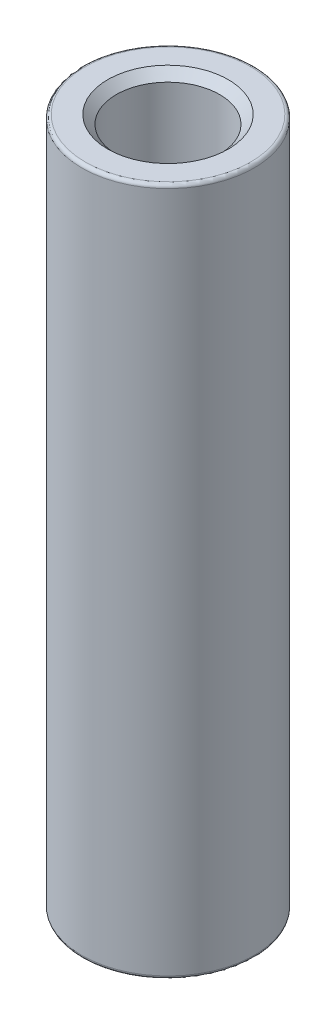
ISO-10303-21;
HEADER;
FILE_DESCRIPTION(('STEP AP214'),'2;1');
FILE_NAME('part.step','',(''),(''),'','','');
FILE_SCHEMA(('AUTOMOTIVE_DESIGN { 1 0 10303 214 1 1 1 1 }'));
ENDSEC;
DATA;
#1=APPLICATION_CONTEXT('core data for automotive mechanical design processes');
#2=APPLICATION_PROTOCOL_DEFINITION('international standard','automotive_design',2000,#1);
#3=PRODUCT_CONTEXT('',#1,'mechanical');
#4=PRODUCT('Part','Part','',(#3));
#5=PRODUCT_RELATED_PRODUCT_CATEGORY('part','',(#4));
#6=PRODUCT_DEFINITION_FORMATION('','',#4);
#7=PRODUCT_DEFINITION_CONTEXT('part definition',#1,'design');
#8=PRODUCT_DEFINITION('design','',#6,#7);
#9=PRODUCT_DEFINITION_SHAPE('','',#8);
#10=(LENGTH_UNIT() NAMED_UNIT(*) SI_UNIT(.MILLI.,.METRE.));
#11=(NAMED_UNIT(*) PLANE_ANGLE_UNIT() SI_UNIT($,.RADIAN.));
#12=(NAMED_UNIT(*) SI_UNIT($,.STERADIAN.) SOLID_ANGLE_UNIT());
#13=UNCERTAINTY_MEASURE_WITH_UNIT(LENGTH_MEASURE(1.E-05),#10,'distance_accuracy_value','');
#14=(GEOMETRIC_REPRESENTATION_CONTEXT(3) GLOBAL_UNCERTAINTY_ASSIGNED_CONTEXT((#13)) GLOBAL_UNIT_ASSIGNED_CONTEXT((#10,
#11,#12)) REPRESENTATION_CONTEXT('',''));
#15=CARTESIAN_POINT('',(0.,0.,0.));
#16=DIRECTION('',(0.,0.,1.));
#17=DIRECTION('',(1.,0.,0.));
#18=AXIS2_PLACEMENT_3D('',#15,#16,#17);
#19=CARTESIAN_POINT('',(0.,10.,0.));
#20=DIRECTION('',(0.,1.,0.));
#21=DIRECTION('',(0.,0.,1.));
#22=AXIS2_PLACEMENT_3D('',#19,#20,#21);
#23=PLANE('',#22);
#24=CARTESIAN_POINT('',(0.,10.,0.));
#25=DIRECTION('',(0.,1.,0.));
#26=DIRECTION('',(0.,0.,1.));
#27=AXIS2_PLACEMENT_3D('',#24,#25,#26);
#28=CIRCLE('',#27,2.4);
#29=CARTESIAN_POINT('',(0.,10.,2.4));
#30=VERTEX_POINT('',#29);
#31=EDGE_CURVE('E10',#30,#30,#28,.T.);
#32=ORIENTED_EDGE('',*,*,#31,.T.);
#33=EDGE_LOOP('',(#32));
#34=FACE_BOUND('',#33,.T.);
#35=CARTESIAN_POINT('',(0.,10.,0.));
#36=DIRECTION('',(0.,1.,0.));
#37=DIRECTION('',(0.,0.,1.));
#38=AXIS2_PLACEMENT_3D('',#35,#36,#37);
#39=CIRCLE('',#38,1.75);
#40=CARTESIAN_POINT('',(0.,10.,1.75));
#41=VERTEX_POINT('',#40);
#42=EDGE_CURVE('E53',#41,#41,#39,.F.);
#43=ORIENTED_EDGE('',*,*,#42,.T.);
#44=EDGE_LOOP('',(#43));
#45=FACE_BOUND('',#44,.T.);
#46=ADVANCED_FACE('F33',(#34,#45),#23,.T.);
#47=CARTESIAN_POINT('',(0.,-10.,0.));
#48=DIRECTION('',(0.,1.,0.));
#49=DIRECTION('',(0.,0.,1.));
#50=AXIS2_PLACEMENT_3D('',#47,#48,#49);
#51=PLANE('',#50);
#52=CARTESIAN_POINT('',(0.,-10.,0.));
#53=DIRECTION('',(0.,1.,0.));
#54=DIRECTION('',(0.,0.,1.));
#55=AXIS2_PLACEMENT_3D('',#52,#53,#54);
#56=CIRCLE('',#55,2.4);
#57=CARTESIAN_POINT('',(0.,-10.,2.4));
#58=VERTEX_POINT('',#57);
#59=EDGE_CURVE('E40',#58,#58,#56,.F.);
#60=ORIENTED_EDGE('',*,*,#59,.T.);
#61=EDGE_LOOP('',(#60));
#62=FACE_BOUND('',#61,.T.);
#63=CARTESIAN_POINT('',(0.,-10.,0.));
#64=DIRECTION('',(0.,1.,0.));
#65=DIRECTION('',(0.,0.,1.));
#66=AXIS2_PLACEMENT_3D('',#63,#64,#65);
#67=CIRCLE('',#66,1.75);
#68=CARTESIAN_POINT('',(0.,-10.,1.75));
#69=VERTEX_POINT('',#68);
#70=EDGE_CURVE('E62',#69,#69,#67,.T.);
#71=ORIENTED_EDGE('',*,*,#70,.T.);
#72=EDGE_LOOP('',(#71));
#73=FACE_BOUND('',#72,.T.);
#74=ADVANCED_FACE('F66',(#62,#73),#51,.F.);
#75=CARTESIAN_POINT('',(0.,10.,0.));
#76=DIRECTION('',(0.,-1.,0.));
#77=DIRECTION('',(0.,0.,-1.));
#78=AXIS2_PLACEMENT_3D('',#75,#76,#77);
#79=CYLINDRICAL_SURFACE('',#78,2.5);
#80=CARTESIAN_POINT('',(0.,-9.9,0.));
#81=DIRECTION('',(0.,1.,0.));
#82=DIRECTION('',(0.,0.,1.));
#83=AXIS2_PLACEMENT_3D('',#80,#81,#82);
#84=CIRCLE('',#83,2.5);
#85=CARTESIAN_POINT('',(0.,-9.9,2.5));
#86=VERTEX_POINT('',#85);
#87=EDGE_CURVE('E44',#86,#86,#84,.T.);
#88=ORIENTED_EDGE('',*,*,#87,.T.);
#89=EDGE_LOOP('',(#88));
#90=FACE_BOUND('',#89,.T.);
#91=CARTESIAN_POINT('',(0.,9.9,0.));
#92=DIRECTION('',(0.,1.,0.));
#93=DIRECTION('',(0.,0.,1.));
#94=AXIS2_PLACEMENT_3D('',#91,#92,#93);
#95=CIRCLE('',#94,2.5);
#96=CARTESIAN_POINT('',(0.,9.9,2.5));
#97=VERTEX_POINT('',#96);
#98=EDGE_CURVE('E48',#97,#97,#95,.F.);
#99=ORIENTED_EDGE('',*,*,#98,.T.);
#100=EDGE_LOOP('',(#99));
#101=FACE_BOUND('',#100,.T.);
#102=ADVANCED_FACE('F81',(#90,#101),#79,.T.);
#103=CARTESIAN_POINT('',(0.,10.,0.));
#104=DIRECTION('',(0.,-1.,0.));
#105=DIRECTION('',(0.,0.,-1.));
#106=AXIS2_PLACEMENT_3D('',#103,#104,#105);
#107=CYLINDRICAL_SURFACE('',#106,1.5);
#108=CARTESIAN_POINT('',(0.,-9.75,0.));
#109=DIRECTION('',(0.,1.,0.));
#110=DIRECTION('',(0.,0.,1.));
#111=AXIS2_PLACEMENT_3D('',#108,#109,#110);
#112=CIRCLE('',#111,1.5);
#113=CARTESIAN_POINT('',(0.,-9.75,1.5));
#114=VERTEX_POINT('',#113);
#115=EDGE_CURVE('E56',#114,#114,#112,.F.);
#116=ORIENTED_EDGE('',*,*,#115,.T.);
#117=EDGE_LOOP('',(#116));
#118=FACE_BOUND('',#117,.T.);
#119=CARTESIAN_POINT('',(0.,9.75,0.));
#120=DIRECTION('',(0.,1.,0.));
#121=DIRECTION('',(0.,0.,1.));
#122=AXIS2_PLACEMENT_3D('',#119,#120,#121);
#123=CIRCLE('',#122,1.5);
#124=CARTESIAN_POINT('',(0.,9.75,1.5));
#125=VERTEX_POINT('',#124);
#126=EDGE_CURVE('E59',#125,#125,#123,.T.);
#127=ORIENTED_EDGE('',*,*,#126,.T.);
#128=EDGE_LOOP('',(#127));
#129=FACE_BOUND('',#128,.T.);
#130=ADVANCED_FACE('F71',(#118,#129),#107,.F.);
#131=CARTESIAN_POINT('',(0.,-10.,0.));
#132=DIRECTION('',(0.,-1.,0.));
#133=DIRECTION('',(0.,0.,-1.));
#134=AXIS2_PLACEMENT_3D('',#131,#132,#133);
#135=CONICAL_SURFACE('',#134,1.75,0.785398163397445);
#136=ORIENTED_EDGE('',*,*,#115,.F.);
#137=EDGE_LOOP('',(#136));
#138=FACE_BOUND('',#137,.T.);
#139=ORIENTED_EDGE('',*,*,#70,.F.);
#140=EDGE_LOOP('',(#139));
#141=FACE_BOUND('',#140,.T.);
#142=ADVANCED_FACE('F68',(#138,#141),#135,.F.);
#143=CARTESIAN_POINT('',(0.,9.75,0.));
#144=DIRECTION('',(0.,1.,0.));
#145=DIRECTION('',(0.,0.,1.));
#146=AXIS2_PLACEMENT_3D('',#143,#144,#145);
#147=CONICAL_SURFACE('',#146,1.5,0.785398163397455);
#148=ORIENTED_EDGE('',*,*,#42,.F.);
#149=EDGE_LOOP('',(#148));
#150=FACE_BOUND('',#149,.T.);
#151=ORIENTED_EDGE('',*,*,#126,.F.);
#152=EDGE_LOOP('',(#151));
#153=FACE_BOUND('',#152,.T.);
#154=ADVANCED_FACE('F70',(#150,#153),#147,.F.);
#155=CARTESIAN_POINT('',(0.,-9.9,0.));
#156=DIRECTION('',(0.,1.,0.));
#157=DIRECTION('',(0.,0.,1.));
#158=AXIS2_PLACEMENT_3D('',#155,#156,#157);
#159=TOROIDAL_SURFACE('',#158,2.4,0.1);
#160=ORIENTED_EDGE('',*,*,#59,.F.);
#161=EDGE_LOOP('',(#160));
#162=FACE_BOUND('',#161,.T.);
#163=ORIENTED_EDGE('',*,*,#87,.F.);
#164=EDGE_LOOP('',(#163));
#165=FACE_BOUND('',#164,.T.);
#166=ADVANCED_FACE('F78',(#162,#165),#159,.T.);
#167=CARTESIAN_POINT('',(0.,9.9,0.));
#168=DIRECTION('',(0.,1.,0.));
#169=DIRECTION('',(0.,0.,1.));
#170=AXIS2_PLACEMENT_3D('',#167,#168,#169);
#171=TOROIDAL_SURFACE('',#170,2.4,0.1);
#172=ORIENTED_EDGE('',*,*,#98,.F.);
#173=EDGE_LOOP('',(#172));
#174=FACE_BOUND('',#173,.T.);
#175=ORIENTED_EDGE('',*,*,#31,.F.);
#176=EDGE_LOOP('',(#175));
#177=FACE_BOUND('',#176,.T.);
#178=ADVANCED_FACE('F35',(#174,#177),#171,.T.);
#179=CLOSED_SHELL('',(#46,#74,#102,#130,#142,#154,#166,#178));
#180=MANIFOLD_SOLID_BREP('B2',#179);
#181=ADVANCED_BREP_SHAPE_REPRESENTATION('',(#18,#180),#14);
#182=SHAPE_DEFINITION_REPRESENTATION(#9,#181);
ENDSEC;
END-ISO-10303-21;
